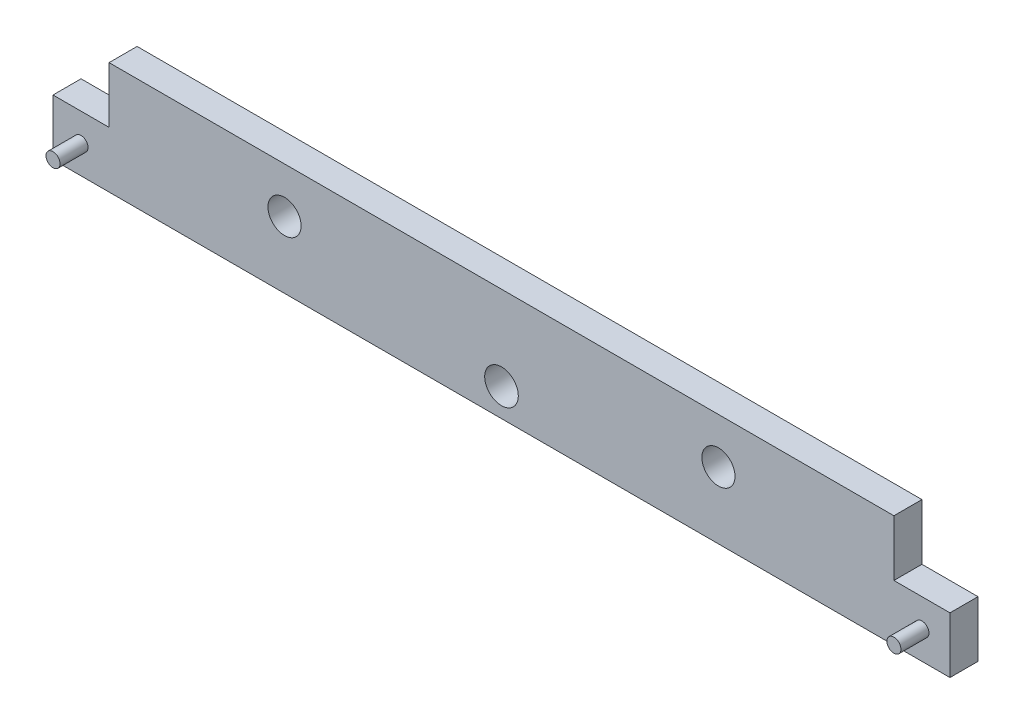
ISO-10303-21;
HEADER;
FILE_DESCRIPTION(('STEP AP214'),'2;1');
FILE_NAME('part.step','',(''),(''),'','','');
FILE_SCHEMA(('AUTOMOTIVE_DESIGN { 1 0 10303 214 1 1 1 1 }'));
ENDSEC;
DATA;
#1=APPLICATION_CONTEXT('core data for automotive mechanical design processes');
#2=APPLICATION_PROTOCOL_DEFINITION('international standard','automotive_design',2000,#1);
#3=PRODUCT_CONTEXT('',#1,'mechanical');
#4=PRODUCT('Part','Part','',(#3));
#5=PRODUCT_RELATED_PRODUCT_CATEGORY('part','',(#4));
#6=PRODUCT_DEFINITION_FORMATION('','',#4);
#7=PRODUCT_DEFINITION_CONTEXT('part definition',#1,'design');
#8=PRODUCT_DEFINITION('design','',#6,#7);
#9=PRODUCT_DEFINITION_SHAPE('','',#8);
#10=(LENGTH_UNIT() NAMED_UNIT(*) SI_UNIT(.MILLI.,.METRE.));
#11=(NAMED_UNIT(*) PLANE_ANGLE_UNIT() SI_UNIT($,.RADIAN.));
#12=(NAMED_UNIT(*) SI_UNIT($,.STERADIAN.) SOLID_ANGLE_UNIT());
#13=UNCERTAINTY_MEASURE_WITH_UNIT(LENGTH_MEASURE(1.E-05),#10,'distance_accuracy_value','');
#14=(GEOMETRIC_REPRESENTATION_CONTEXT(3) GLOBAL_UNCERTAINTY_ASSIGNED_CONTEXT((#13)) GLOBAL_UNIT_ASSIGNED_CONTEXT((#10,
#11,#12)) REPRESENTATION_CONTEXT('',''));
#15=CARTESIAN_POINT('',(0.,0.,0.));
#16=DIRECTION('',(0.,0.,1.));
#17=DIRECTION('',(1.,0.,0.));
#18=AXIS2_PLACEMENT_3D('',#15,#16,#17);
#19=CARTESIAN_POINT('',(0.,20.,10.));
#20=DIRECTION('',(0.,-1.,0.));
#21=DIRECTION('',(1.,0.,0.));
#22=AXIS2_PLACEMENT_3D('',#19,#20,#21);
#23=PLANE('',#22);
#24=DIRECTION('',(0.,0.,-1.));
#25=VECTOR('',#24,1.);
#26=CARTESIAN_POINT('',(-20.,20.,10.));
#27=LINE('',#26,#25);
#28=CARTESIAN_POINT('',(-20.,20.,10.));
#29=VERTEX_POINT('',#28);
#30=CARTESIAN_POINT('',(-20.,20.,0.));
#31=VERTEX_POINT('',#30);
#32=EDGE_CURVE('E51',#29,#31,#27,.T.);
#33=ORIENTED_EDGE('',*,*,#32,.F.);
#34=DIRECTION('',(-1.,0.,0.));
#35=VECTOR('',#34,1.);
#36=CARTESIAN_POINT('',(0.,20.,10.));
#37=LINE('',#36,#35);
#38=CARTESIAN_POINT('',(0.,20.,10.));
#39=VERTEX_POINT('',#38);
#40=EDGE_CURVE('E146',#39,#29,#37,.T.);
#41=ORIENTED_EDGE('',*,*,#40,.F.);
#42=DIRECTION('',(0.,0.,-1.));
#43=VECTOR('',#42,1.);
#44=CARTESIAN_POINT('',(0.,20.,10.));
#45=LINE('',#44,#43);
#46=CARTESIAN_POINT('',(0.,20.,0.));
#47=VERTEX_POINT('',#46);
#48=EDGE_CURVE('E44',#39,#47,#45,.T.);
#49=ORIENTED_EDGE('',*,*,#48,.T.);
#50=DIRECTION('',(-1.,0.,0.));
#51=VECTOR('',#50,1.);
#52=CARTESIAN_POINT('',(0.,20.,0.));
#53=LINE('',#52,#51);
#54=EDGE_CURVE('E156',#47,#31,#53,.T.);
#55=ORIENTED_EDGE('',*,*,#54,.T.);
#56=EDGE_LOOP('',(#33,#41,#49,#55));
#57=FACE_BOUND('',#56,.T.);
#58=ADVANCED_FACE('F35',(#57),#23,.F.);
#59=DIRECTION('',(0.,0.,1.));
#60=VECTOR('',#59,1.);
#61=CARTESIAN_POINT('',(-300.,20.,10.));
#62=LINE('',#61,#60);
#63=CARTESIAN_POINT('',(-300.,20.,0.));
#64=VERTEX_POINT('',#63);
#65=CARTESIAN_POINT('',(-300.,20.,10.));
#66=VERTEX_POINT('',#65);
#67=EDGE_CURVE('E59',#64,#66,#62,.T.);
#68=ORIENTED_EDGE('',*,*,#67,.F.);
#69=CARTESIAN_POINT('',(-320.,20.,0.));
#70=VERTEX_POINT('',#69);
#71=EDGE_CURVE('E155',#64,#70,#53,.T.);
#72=ORIENTED_EDGE('',*,*,#71,.T.);
#73=DIRECTION('',(0.,0.,-1.));
#74=VECTOR('',#73,1.);
#75=CARTESIAN_POINT('',(-320.,20.,10.));
#76=LINE('',#75,#74);
#77=CARTESIAN_POINT('',(-320.,20.,10.));
#78=VERTEX_POINT('',#77);
#79=EDGE_CURVE('E166',#78,#70,#76,.T.);
#80=ORIENTED_EDGE('',*,*,#79,.F.);
#81=EDGE_CURVE('E144',#66,#78,#37,.T.);
#82=ORIENTED_EDGE('',*,*,#81,.F.);
#83=EDGE_LOOP('',(#68,#72,#80,#82));
#84=FACE_BOUND('',#83,.T.);
#85=ADVANCED_FACE('F184',(#84),#23,.F.);
#86=CARTESIAN_POINT('',(0.,0.,10.));
#87=DIRECTION('',(-1.,0.,0.));
#88=DIRECTION('',(0.,0.,1.));
#89=AXIS2_PLACEMENT_3D('',#86,#87,#88);
#90=PLANE('',#89);
#91=DIRECTION('',(0.,1.,0.));
#92=VECTOR('',#91,1.);
#93=CARTESIAN_POINT('',(0.,0.,0.));
#94=LINE('',#93,#92);
#95=CARTESIAN_POINT('',(0.,0.,0.));
#96=VERTEX_POINT('',#95);
#97=EDGE_CURVE('E138',#96,#47,#94,.T.);
#98=ORIENTED_EDGE('',*,*,#97,.T.);
#99=ORIENTED_EDGE('',*,*,#48,.F.);
#100=DIRECTION('',(0.,1.,0.));
#101=VECTOR('',#100,1.);
#102=CARTESIAN_POINT('',(0.,0.,10.));
#103=LINE('',#102,#101);
#104=CARTESIAN_POINT('',(0.,0.,10.));
#105=VERTEX_POINT('',#104);
#106=EDGE_CURVE('E141',#105,#39,#103,.T.);
#107=ORIENTED_EDGE('',*,*,#106,.F.);
#108=DIRECTION('',(0.,0.,-1.));
#109=VECTOR('',#108,1.);
#110=CARTESIAN_POINT('',(0.,0.,10.));
#111=LINE('',#110,#109);
#112=EDGE_CURVE('E152',#105,#96,#111,.T.);
#113=ORIENTED_EDGE('',*,*,#112,.T.);
#114=EDGE_LOOP('',(#98,#99,#107,#113));
#115=FACE_BOUND('',#114,.T.);
#116=ADVANCED_FACE('F37',(#115),#90,.F.);
#117=CARTESIAN_POINT('',(-320.,0.,10.));
#118=DIRECTION('',(1.,0.,0.));
#119=DIRECTION('',(0.,0.,-1.));
#120=AXIS2_PLACEMENT_3D('',#117,#118,#119);
#121=PLANE('',#120);
#122=DIRECTION('',(0.,-1.,0.));
#123=VECTOR('',#122,1.);
#124=CARTESIAN_POINT('',(-320.,0.,0.));
#125=LINE('',#124,#123);
#126=CARTESIAN_POINT('',(-320.,0.,0.));
#127=VERTEX_POINT('',#126);
#128=EDGE_CURVE('E158',#70,#127,#125,.T.);
#129=ORIENTED_EDGE('',*,*,#128,.T.);
#130=DIRECTION('',(0.,0.,-1.));
#131=VECTOR('',#130,1.);
#132=CARTESIAN_POINT('',(-320.,0.,10.));
#133=LINE('',#132,#131);
#134=CARTESIAN_POINT('',(-320.,0.,10.));
#135=VERTEX_POINT('',#134);
#136=EDGE_CURVE('E163',#135,#127,#133,.T.);
#137=ORIENTED_EDGE('',*,*,#136,.F.);
#138=DIRECTION('',(0.,-1.,0.));
#139=VECTOR('',#138,1.);
#140=CARTESIAN_POINT('',(-320.,0.,10.));
#141=LINE('',#140,#139);
#142=EDGE_CURVE('E148',#78,#135,#141,.T.);
#143=ORIENTED_EDGE('',*,*,#142,.F.);
#144=ORIENTED_EDGE('',*,*,#79,.T.);
#145=EDGE_LOOP('',(#129,#137,#143,#144));
#146=FACE_BOUND('',#145,.T.);
#147=ADVANCED_FACE('F182',(#146),#121,.F.);
#148=CARTESIAN_POINT('',(0.,0.,10.));
#149=DIRECTION('',(0.,1.,0.));
#150=DIRECTION('',(-1.,0.,0.));
#151=AXIS2_PLACEMENT_3D('',#148,#149,#150);
#152=PLANE('',#151);
#153=DIRECTION('',(1.,0.,0.));
#154=VECTOR('',#153,1.);
#155=CARTESIAN_POINT('',(0.,0.,0.));
#156=LINE('',#155,#154);
#157=EDGE_CURVE('E145',#127,#96,#156,.T.);
#158=ORIENTED_EDGE('',*,*,#157,.T.);
#159=ORIENTED_EDGE('',*,*,#112,.F.);
#160=DIRECTION('',(1.,0.,0.));
#161=VECTOR('',#160,1.);
#162=CARTESIAN_POINT('',(0.,0.,10.));
#163=LINE('',#162,#161);
#164=EDGE_CURVE('E150',#135,#105,#163,.T.);
#165=ORIENTED_EDGE('',*,*,#164,.F.);
#166=ORIENTED_EDGE('',*,*,#136,.T.);
#167=EDGE_LOOP('',(#158,#159,#165,#166));
#168=FACE_BOUND('',#167,.T.);
#169=ADVANCED_FACE('F177',(#168),#152,.F.);
#170=CARTESIAN_POINT('',(0.,0.,10.));
#171=DIRECTION('',(0.,0.,1.));
#172=DIRECTION('',(1.,0.,0.));
#173=AXIS2_PLACEMENT_3D('',#170,#171,#172);
#174=PLANE('',#173);
#175=CARTESIAN_POINT('',(-82.5986086394505,23.7772506923761,10.));
#176=DIRECTION('',(0.,0.,1.));
#177=DIRECTION('',(1.,0.,0.));
#178=AXIS2_PLACEMENT_3D('',#175,#176,#177);
#179=CIRCLE('',#178,5.91291427075917);
#180=CARTESIAN_POINT('',(-76.6856943686913,23.7772506923761,10.));
#181=VERTEX_POINT('',#180);
#182=EDGE_CURVE('E369',#181,#181,#179,.F.);
#183=ORIENTED_EDGE('',*,*,#182,.T.);
#184=EDGE_LOOP('',(#183));
#185=FACE_BOUND('',#184,.T.);
#186=CARTESIAN_POINT('',(-237.401391360549,23.7772506923761,10.));
#187=DIRECTION('',(0.,0.,1.));
#188=DIRECTION('',(1.,0.,0.));
#189=AXIS2_PLACEMENT_3D('',#186,#187,#188);
#190=CIRCLE('',#189,5.91291427075917);
#191=CARTESIAN_POINT('',(-231.48847708979,23.7772506923761,10.));
#192=VERTEX_POINT('',#191);
#193=EDGE_CURVE('E194',#192,#192,#190,.T.);
#194=ORIENTED_EDGE('',*,*,#193,.F.);
#195=EDGE_LOOP('',(#194));
#196=FACE_BOUND('',#195,.T.);
#197=CARTESIAN_POINT('',(-160.,9.99999999999996,10.));
#198=DIRECTION('',(0.,0.,1.));
#199=DIRECTION('',(1.,0.,0.));
#200=AXIS2_PLACEMENT_3D('',#197,#198,#199);
#201=CIRCLE('',#200,6.00000000000002);
#202=CARTESIAN_POINT('',(-154.,9.99999999999996,10.));
#203=VERTEX_POINT('',#202);
#204=EDGE_CURVE('E123',#203,#203,#201,.T.);
#205=ORIENTED_EDGE('',*,*,#204,.F.);
#206=EDGE_LOOP('',(#205));
#207=FACE_BOUND('',#206,.T.);
#208=CARTESIAN_POINT('',(-310.,10.,10.));
#209=DIRECTION('',(0.,0.,1.));
#210=DIRECTION('',(1.,0.,0.));
#211=AXIS2_PLACEMENT_3D('',#208,#209,#210);
#212=CIRCLE('',#211,2.5);
#213=CARTESIAN_POINT('',(-307.5,10.,10.));
#214=VERTEX_POINT('',#213);
#215=EDGE_CURVE('E11',#214,#214,#212,.T.);
#216=ORIENTED_EDGE('',*,*,#215,.F.);
#217=EDGE_LOOP('',(#216));
#218=FACE_BOUND('',#217,.T.);
#219=CARTESIAN_POINT('',(-10.,10.,10.));
#220=DIRECTION('',(0.,0.,1.));
#221=DIRECTION('',(1.,0.,0.));
#222=AXIS2_PLACEMENT_3D('',#219,#220,#221);
#223=CIRCLE('',#222,2.5);
#224=CARTESIAN_POINT('',(-7.5,10.,10.));
#225=VERTEX_POINT('',#224);
#226=EDGE_CURVE('E134',#225,#225,#223,.T.);
#227=ORIENTED_EDGE('',*,*,#226,.F.);
#228=EDGE_LOOP('',(#227));
#229=FACE_BOUND('',#228,.T.);
#230=ORIENTED_EDGE('',*,*,#106,.T.);
#231=ORIENTED_EDGE('',*,*,#40,.T.);
#232=DIRECTION('',(0.,-1.,0.));
#233=VECTOR('',#232,1.);
#234=CARTESIAN_POINT('',(-20.,40.,10.));
#235=LINE('',#234,#233);
#236=CARTESIAN_POINT('',(-20.,40.,10.));
#237=VERTEX_POINT('',#236);
#238=EDGE_CURVE('E190',#237,#29,#235,.T.);
#239=ORIENTED_EDGE('',*,*,#238,.F.);
#240=DIRECTION('',(1.,0.,0.));
#241=VECTOR('',#240,1.);
#242=CARTESIAN_POINT('',(-20.,40.,10.));
#243=LINE('',#242,#241);
#244=CARTESIAN_POINT('',(-300.,40.,10.));
#245=VERTEX_POINT('',#244);
#246=EDGE_CURVE('E117',#245,#237,#243,.T.);
#247=ORIENTED_EDGE('',*,*,#246,.F.);
#248=DIRECTION('',(0.,-1.,0.));
#249=VECTOR('',#248,1.);
#250=CARTESIAN_POINT('',(-300.,40.,10.));
#251=LINE('',#250,#249);
#252=EDGE_CURVE('E127',#245,#66,#251,.T.);
#253=ORIENTED_EDGE('',*,*,#252,.T.);
#254=ORIENTED_EDGE('',*,*,#81,.T.);
#255=ORIENTED_EDGE('',*,*,#142,.T.);
#256=ORIENTED_EDGE('',*,*,#164,.T.);
#257=EDGE_LOOP('',(#230,#231,#239,#247,#253,#254,#255,#256));
#258=FACE_BOUND('',#257,.T.);
#259=ADVANCED_FACE('F197',(#185,#196,#207,#218,#229,#258),#174,.T.);
#260=CARTESIAN_POINT('',(0.,0.,0.));
#261=DIRECTION('',(0.,0.,1.));
#262=DIRECTION('',(1.,0.,0.));
#263=AXIS2_PLACEMENT_3D('',#260,#261,#262);
#264=PLANE('',#263);
#265=CARTESIAN_POINT('',(-82.5986086394505,23.7772506923761,0.));
#266=DIRECTION('',(0.,0.,1.));
#267=DIRECTION('',(1.,0.,0.));
#268=AXIS2_PLACEMENT_3D('',#265,#266,#267);
#269=CIRCLE('',#268,5.91291427075917);
#270=CARTESIAN_POINT('',(-76.6856943686913,23.7772506923761,0.));
#271=VERTEX_POINT('',#270);
#272=EDGE_CURVE('E372',#271,#271,#269,.T.);
#273=ORIENTED_EDGE('',*,*,#272,.T.);
#274=EDGE_LOOP('',(#273));
#275=FACE_BOUND('',#274,.T.);
#276=CARTESIAN_POINT('',(-237.401391360549,23.7772506923761,0.));
#277=DIRECTION('',(0.,0.,-1.));
#278=DIRECTION('',(-1.,0.,0.));
#279=AXIS2_PLACEMENT_3D('',#276,#277,#278);
#280=CIRCLE('',#279,5.91291427075917);
#281=CARTESIAN_POINT('',(-243.314305631309,23.7772506923761,0.));
#282=VERTEX_POINT('',#281);
#283=EDGE_CURVE('E374',#282,#282,#280,.T.);
#284=ORIENTED_EDGE('',*,*,#283,.F.);
#285=EDGE_LOOP('',(#284));
#286=FACE_BOUND('',#285,.T.);
#287=CARTESIAN_POINT('',(-160.,9.99999999999996,0.));
#288=DIRECTION('',(0.,0.,1.));
#289=DIRECTION('',(1.,0.,0.));
#290=AXIS2_PLACEMENT_3D('',#287,#288,#289);
#291=CIRCLE('',#290,6.00000000000002);
#292=CARTESIAN_POINT('',(-154.,9.99999999999996,0.));
#293=VERTEX_POINT('',#292);
#294=EDGE_CURVE('E39',#293,#293,#291,.T.);
#295=ORIENTED_EDGE('',*,*,#294,.T.);
#296=EDGE_LOOP('',(#295));
#297=FACE_BOUND('',#296,.T.);
#298=ORIENTED_EDGE('',*,*,#97,.F.);
#299=ORIENTED_EDGE('',*,*,#157,.F.);
#300=ORIENTED_EDGE('',*,*,#128,.F.);
#301=ORIENTED_EDGE('',*,*,#71,.F.);
#302=DIRECTION('',(0.,-1.,0.));
#303=VECTOR('',#302,1.);
#304=CARTESIAN_POINT('',(-300.,40.,0.));
#305=LINE('',#304,#303);
#306=CARTESIAN_POINT('',(-300.,40.,0.));
#307=VERTEX_POINT('',#306);
#308=EDGE_CURVE('E108',#307,#64,#305,.T.);
#309=ORIENTED_EDGE('',*,*,#308,.F.);
#310=DIRECTION('',(-1.,0.,0.));
#311=VECTOR('',#310,1.);
#312=CARTESIAN_POINT('',(-20.,40.,0.));
#313=LINE('',#312,#311);
#314=CARTESIAN_POINT('',(-20.,40.,0.));
#315=VERTEX_POINT('',#314);
#316=EDGE_CURVE('E101',#315,#307,#313,.T.);
#317=ORIENTED_EDGE('',*,*,#316,.F.);
#318=DIRECTION('',(0.,-1.,0.));
#319=VECTOR('',#318,1.);
#320=CARTESIAN_POINT('',(-20.,40.,0.));
#321=LINE('',#320,#319);
#322=EDGE_CURVE('E106',#315,#31,#321,.T.);
#323=ORIENTED_EDGE('',*,*,#322,.T.);
#324=ORIENTED_EDGE('',*,*,#54,.F.);
#325=EDGE_LOOP('',(#298,#299,#300,#301,#309,#317,#323,#324));
#326=FACE_BOUND('',#325,.T.);
#327=ADVANCED_FACE('F104',(#275,#286,#297,#326),#264,.F.);
#328=CARTESIAN_POINT('',(-10.,10.,20.));
#329=DIRECTION('',(0.,0.,-1.));
#330=DIRECTION('',(-1.,0.,0.));
#331=AXIS2_PLACEMENT_3D('',#328,#329,#330);
#332=CYLINDRICAL_SURFACE('',#331,2.5);
#333=CARTESIAN_POINT('',(-10.,10.,20.));
#334=DIRECTION('',(0.,0.,1.));
#335=DIRECTION('',(1.,0.,0.));
#336=AXIS2_PLACEMENT_3D('',#333,#334,#335);
#337=CIRCLE('',#336,2.5);
#338=CARTESIAN_POINT('',(-7.5,10.,20.));
#339=VERTEX_POINT('',#338);
#340=EDGE_CURVE('E135',#339,#339,#337,.T.);
#341=ORIENTED_EDGE('',*,*,#340,.F.);
#342=EDGE_LOOP('',(#341));
#343=FACE_BOUND('',#342,.T.);
#344=ORIENTED_EDGE('',*,*,#226,.T.);
#345=EDGE_LOOP('',(#344));
#346=FACE_BOUND('',#345,.T.);
#347=ADVANCED_FACE('F205',(#343,#346),#332,.T.);
#348=CARTESIAN_POINT('',(-10.,10.,20.));
#349=DIRECTION('',(0.,0.,1.));
#350=DIRECTION('',(1.,0.,0.));
#351=AXIS2_PLACEMENT_3D('',#348,#349,#350);
#352=PLANE('',#351);
#353=ORIENTED_EDGE('',*,*,#340,.T.);
#354=EDGE_LOOP('',(#353));
#355=FACE_BOUND('',#354,.T.);
#356=ADVANCED_FACE('F306',(#355),#352,.T.);
#357=CARTESIAN_POINT('',(-310.,10.,20.));
#358=DIRECTION('',(0.,0.,-1.));
#359=DIRECTION('',(-1.,0.,0.));
#360=AXIS2_PLACEMENT_3D('',#357,#358,#359);
#361=CYLINDRICAL_SURFACE('',#360,2.5);
#362=CARTESIAN_POINT('',(-310.,10.,20.));
#363=DIRECTION('',(0.,0.,-1.));
#364=DIRECTION('',(-1.,0.,0.));
#365=AXIS2_PLACEMENT_3D('',#362,#363,#364);
#366=CIRCLE('',#365,2.5);
#367=CARTESIAN_POINT('',(-312.5,10.,20.));
#368=VERTEX_POINT('',#367);
#369=EDGE_CURVE('E131',#368,#368,#366,.T.);
#370=ORIENTED_EDGE('',*,*,#369,.T.);
#371=EDGE_LOOP('',(#370));
#372=FACE_BOUND('',#371,.T.);
#373=ORIENTED_EDGE('',*,*,#215,.T.);
#374=EDGE_LOOP('',(#373));
#375=FACE_BOUND('',#374,.T.);
#376=ADVANCED_FACE('F302',(#372,#375),#361,.T.);
#377=CARTESIAN_POINT('',(-310.,10.,20.));
#378=DIRECTION('',(0.,0.,1.));
#379=DIRECTION('',(-1.,0.,0.));
#380=AXIS2_PLACEMENT_3D('',#377,#378,#379);
#381=PLANE('',#380);
#382=ORIENTED_EDGE('',*,*,#369,.F.);
#383=EDGE_LOOP('',(#382));
#384=FACE_BOUND('',#383,.T.);
#385=ADVANCED_FACE('F298',(#384),#381,.T.);
#386=CARTESIAN_POINT('',(-160.,9.99999999999996,-50.));
#387=DIRECTION('',(0.,0.,1.));
#388=DIRECTION('',(1.,0.,0.));
#389=AXIS2_PLACEMENT_3D('',#386,#387,#388);
#390=CYLINDRICAL_SURFACE('',#389,6.00000000000002);
#391=ORIENTED_EDGE('',*,*,#204,.T.);
#392=EDGE_LOOP('',(#391));
#393=FACE_BOUND('',#392,.T.);
#394=ORIENTED_EDGE('',*,*,#294,.F.);
#395=EDGE_LOOP('',(#394));
#396=FACE_BOUND('',#395,.T.);
#397=ADVANCED_FACE('F240',(#393,#396),#390,.F.);
#398=CARTESIAN_POINT('',(-20.,40.,10.));
#399=DIRECTION('',(-1.,0.,0.));
#400=DIRECTION('',(0.,-1.,0.));
#401=AXIS2_PLACEMENT_3D('',#398,#399,#400);
#402=PLANE('',#401);
#403=ORIENTED_EDGE('',*,*,#32,.T.);
#404=ORIENTED_EDGE('',*,*,#322,.F.);
#405=DIRECTION('',(0.,0.,-1.));
#406=VECTOR('',#405,1.);
#407=CARTESIAN_POINT('',(-20.,40.,10.));
#408=LINE('',#407,#406);
#409=EDGE_CURVE('E112',#237,#315,#408,.T.);
#410=ORIENTED_EDGE('',*,*,#409,.F.);
#411=ORIENTED_EDGE('',*,*,#238,.T.);
#412=EDGE_LOOP('',(#403,#404,#410,#411));
#413=FACE_BOUND('',#412,.T.);
#414=ADVANCED_FACE('F122',(#413),#402,.F.);
#415=CARTESIAN_POINT('',(-300.,40.,10.));
#416=DIRECTION('',(1.,0.,0.));
#417=DIRECTION('',(0.,1.,0.));
#418=AXIS2_PLACEMENT_3D('',#415,#416,#417);
#419=PLANE('',#418);
#420=ORIENTED_EDGE('',*,*,#67,.T.);
#421=ORIENTED_EDGE('',*,*,#252,.F.);
#422=DIRECTION('',(0.,0.,1.));
#423=VECTOR('',#422,1.);
#424=CARTESIAN_POINT('',(-300.,40.,10.));
#425=LINE('',#424,#423);
#426=EDGE_CURVE('E111',#307,#245,#425,.T.);
#427=ORIENTED_EDGE('',*,*,#426,.F.);
#428=ORIENTED_EDGE('',*,*,#308,.T.);
#429=EDGE_LOOP('',(#420,#421,#427,#428));
#430=FACE_BOUND('',#429,.T.);
#431=ADVANCED_FACE('F186',(#430),#419,.F.);
#432=CARTESIAN_POINT('',(0.,40.,0.));
#433=DIRECTION('',(0.,1.,0.));
#434=DIRECTION('',(-1.,0.,0.));
#435=AXIS2_PLACEMENT_3D('',#432,#433,#434);
#436=PLANE('',#435);
#437=ORIENTED_EDGE('',*,*,#409,.T.);
#438=ORIENTED_EDGE('',*,*,#316,.T.);
#439=ORIENTED_EDGE('',*,*,#426,.T.);
#440=ORIENTED_EDGE('',*,*,#246,.T.);
#441=EDGE_LOOP('',(#437,#438,#439,#440));
#442=FACE_BOUND('',#441,.T.);
#443=ADVANCED_FACE('F115',(#442),#436,.T.);
#444=CARTESIAN_POINT('',(-237.401391360549,23.7772506923761,20.));
#445=DIRECTION('',(0.,0.,-1.));
#446=DIRECTION('',(-1.,0.,0.));
#447=AXIS2_PLACEMENT_3D('',#444,#445,#446);
#448=CYLINDRICAL_SURFACE('',#447,5.91291427075917);
#449=ORIENTED_EDGE('',*,*,#193,.T.);
#450=EDGE_LOOP('',(#449));
#451=FACE_BOUND('',#450,.T.);
#452=ORIENTED_EDGE('',*,*,#283,.T.);
#453=EDGE_LOOP('',(#452));
#454=FACE_BOUND('',#453,.T.);
#455=ADVANCED_FACE('F259',(#451,#454),#448,.F.);
#456=CARTESIAN_POINT('',(-82.5986086394505,23.7772506923761,20.));
#457=DIRECTION('',(0.,0.,-1.));
#458=DIRECTION('',(-1.,0.,0.));
#459=AXIS2_PLACEMENT_3D('',#456,#457,#458);
#460=CYLINDRICAL_SURFACE('',#459,5.91291427075917);
#461=ORIENTED_EDGE('',*,*,#182,.F.);
#462=EDGE_LOOP('',(#461));
#463=FACE_BOUND('',#462,.T.);
#464=ORIENTED_EDGE('',*,*,#272,.F.);
#465=EDGE_LOOP('',(#464));
#466=FACE_BOUND('',#465,.T.);
#467=ADVANCED_FACE('F267',(#463,#466),#460,.F.);
#468=CLOSED_SHELL('',(#58,#85,#116,#147,#169,#259,#327,#347,#356,#376,#385,#397,#414,#431,#443,
#455,#467));
#469=MANIFOLD_SOLID_BREP('B2',#468);
#470=ADVANCED_BREP_SHAPE_REPRESENTATION('',(#18,#469),#14);
#471=SHAPE_DEFINITION_REPRESENTATION(#9,#470);
ENDSEC;
END-ISO-10303-21;
